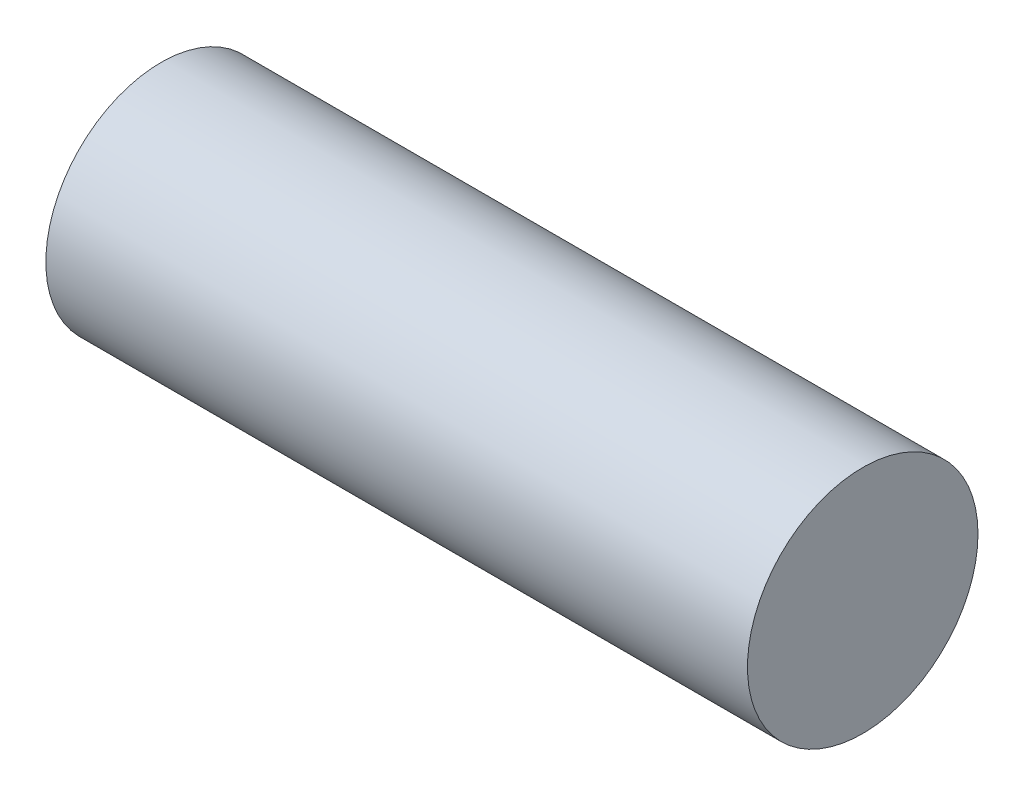
ISO-10303-21;
HEADER;
FILE_DESCRIPTION(('STEP AP214'),'2;1');
FILE_NAME('part.step','',(''),(''),'','','');
FILE_SCHEMA(('AUTOMOTIVE_DESIGN { 1 0 10303 214 1 1 1 1 }'));
ENDSEC;
DATA;
#1=APPLICATION_CONTEXT('core data for automotive mechanical design processes');
#2=APPLICATION_PROTOCOL_DEFINITION('international standard','automotive_design',2000,#1);
#3=PRODUCT_CONTEXT('',#1,'mechanical');
#4=PRODUCT('Part','Part','',(#3));
#5=PRODUCT_RELATED_PRODUCT_CATEGORY('part','',(#4));
#6=PRODUCT_DEFINITION_FORMATION('','',#4);
#7=PRODUCT_DEFINITION_CONTEXT('part definition',#1,'design');
#8=PRODUCT_DEFINITION('design','',#6,#7);
#9=PRODUCT_DEFINITION_SHAPE('','',#8);
#10=(LENGTH_UNIT() NAMED_UNIT(*) SI_UNIT(.MILLI.,.METRE.));
#11=(NAMED_UNIT(*) PLANE_ANGLE_UNIT() SI_UNIT($,.RADIAN.));
#12=(NAMED_UNIT(*) SI_UNIT($,.STERADIAN.) SOLID_ANGLE_UNIT());
#13=UNCERTAINTY_MEASURE_WITH_UNIT(LENGTH_MEASURE(1.E-05),#10,'distance_accuracy_value','');
#14=(GEOMETRIC_REPRESENTATION_CONTEXT(3) GLOBAL_UNCERTAINTY_ASSIGNED_CONTEXT((#13)) GLOBAL_UNIT_ASSIGNED_CONTEXT((#10,
#11,#12)) REPRESENTATION_CONTEXT('',''));
#15=CARTESIAN_POINT('',(0.,0.,0.));
#16=DIRECTION('',(0.,0.,1.));
#17=DIRECTION('',(1.,0.,0.));
#18=AXIS2_PLACEMENT_3D('',#15,#16,#17);
#19=CARTESIAN_POINT('',(7.,0.,0.));
#20=DIRECTION('',(-1.,0.,0.));
#21=DIRECTION('',(0.,0.,1.));
#22=AXIS2_PLACEMENT_3D('',#19,#20,#21);
#23=CYLINDRICAL_SURFACE('',#22,2.3);
#24=CARTESIAN_POINT('',(7.,0.,0.));
#25=DIRECTION('',(1.,0.,0.));
#26=DIRECTION('',(0.,0.,-1.));
#27=AXIS2_PLACEMENT_3D('',#24,#25,#26);
#28=CIRCLE('',#27,2.3);
#29=CARTESIAN_POINT('',(7.,0.,-2.3));
#30=VERTEX_POINT('',#29);
#31=EDGE_CURVE('E10',#30,#30,#28,.T.);
#32=ORIENTED_EDGE('',*,*,#31,.F.);
#33=EDGE_LOOP('',(#32));
#34=FACE_BOUND('',#33,.T.);
#35=CARTESIAN_POINT('',(-7.,0.,0.));
#36=DIRECTION('',(1.,0.,0.));
#37=DIRECTION('',(0.,0.,-1.));
#38=AXIS2_PLACEMENT_3D('',#35,#36,#37);
#39=CIRCLE('',#38,2.3);
#40=CARTESIAN_POINT('',(-7.,0.,-2.3));
#41=VERTEX_POINT('',#40);
#42=EDGE_CURVE('E45',#41,#41,#39,.T.);
#43=ORIENTED_EDGE('',*,*,#42,.T.);
#44=EDGE_LOOP('',(#43));
#45=FACE_BOUND('',#44,.T.);
#46=ADVANCED_FACE('F39',(#34,#45),#23,.T.);
#47=CARTESIAN_POINT('',(7.,0.,0.));
#48=DIRECTION('',(1.,0.,0.));
#49=DIRECTION('',(0.,0.,-1.));
#50=AXIS2_PLACEMENT_3D('',#47,#48,#49);
#51=PLANE('',#50);
#52=ORIENTED_EDGE('',*,*,#31,.T.);
#53=EDGE_LOOP('',(#52));
#54=FACE_BOUND('',#53,.T.);
#55=ADVANCED_FACE('F53',(#54),#51,.T.);
#56=CARTESIAN_POINT('',(-7.,0.,0.));
#57=DIRECTION('',(1.,0.,0.));
#58=DIRECTION('',(0.,0.,-1.));
#59=AXIS2_PLACEMENT_3D('',#56,#57,#58);
#60=PLANE('',#59);
#61=ORIENTED_EDGE('',*,*,#42,.F.);
#62=EDGE_LOOP('',(#61));
#63=FACE_BOUND('',#62,.T.);
#64=ADVANCED_FACE('F55',(#63),#60,.F.);
#65=CLOSED_SHELL('',(#46,#55,#64));
#66=MANIFOLD_SOLID_BREP('B2',#65);
#67=ADVANCED_BREP_SHAPE_REPRESENTATION('',(#18,#66),#14);
#68=SHAPE_DEFINITION_REPRESENTATION(#9,#67);
ENDSEC;
END-ISO-10303-21;
